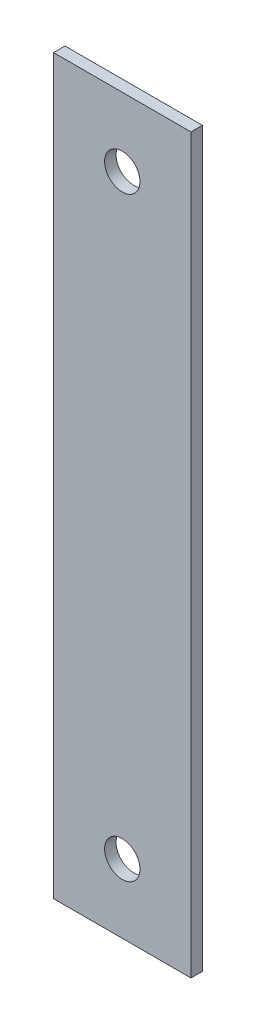
ISO-10303-21;
HEADER;
FILE_DESCRIPTION(('STEP AP214'),'2;1');
FILE_NAME('part.step','',(''),(''),'','','');
FILE_SCHEMA(('AUTOMOTIVE_DESIGN { 1 0 10303 214 1 1 1 1 }'));
ENDSEC;
DATA;
#1=APPLICATION_CONTEXT('core data for automotive mechanical design processes');
#2=APPLICATION_PROTOCOL_DEFINITION('international standard','automotive_design',2000,#1);
#3=PRODUCT_CONTEXT('',#1,'mechanical');
#4=PRODUCT('Part','Part','',(#3));
#5=PRODUCT_RELATED_PRODUCT_CATEGORY('part','',(#4));
#6=PRODUCT_DEFINITION_FORMATION('','',#4);
#7=PRODUCT_DEFINITION_CONTEXT('part definition',#1,'design');
#8=PRODUCT_DEFINITION('design','',#6,#7);
#9=PRODUCT_DEFINITION_SHAPE('','',#8);
#10=(LENGTH_UNIT() NAMED_UNIT(*) SI_UNIT(.MILLI.,.METRE.));
#11=(NAMED_UNIT(*) PLANE_ANGLE_UNIT() SI_UNIT($,.RADIAN.));
#12=(NAMED_UNIT(*) SI_UNIT($,.STERADIAN.) SOLID_ANGLE_UNIT());
#13=UNCERTAINTY_MEASURE_WITH_UNIT(LENGTH_MEASURE(1.E-05),#10,'distance_accuracy_value','');
#14=(GEOMETRIC_REPRESENTATION_CONTEXT(3) GLOBAL_UNCERTAINTY_ASSIGNED_CONTEXT((#13)) GLOBAL_UNIT_ASSIGNED_CONTEXT((#10,
#11,#12)) REPRESENTATION_CONTEXT('',''));
#15=CARTESIAN_POINT('',(0.,0.,0.));
#16=DIRECTION('',(0.,0.,1.));
#17=DIRECTION('',(1.,0.,0.));
#18=AXIS2_PLACEMENT_3D('',#15,#16,#17);
#19=CARTESIAN_POINT('',(0.,0.,3.175));
#20=DIRECTION('',(1.,0.,0.));
#21=DIRECTION('',(0.,0.,-1.));
#22=AXIS2_PLACEMENT_3D('',#19,#20,#21);
#23=PLANE('',#22);
#24=DIRECTION('',(0.,-1.,0.));
#25=VECTOR('',#24,1.);
#26=CARTESIAN_POINT('',(0.,0.,0.));
#27=LINE('',#26,#25);
#28=CARTESIAN_POINT('',(0.,203.2,0.));
#29=VERTEX_POINT('',#28);
#30=CARTESIAN_POINT('',(0.,0.,0.));
#31=VERTEX_POINT('',#30);
#32=EDGE_CURVE('E96',#29,#31,#27,.T.);
#33=ORIENTED_EDGE('',*,*,#32,.T.);
#34=DIRECTION('',(0.,0.,-1.));
#35=VECTOR('',#34,1.);
#36=CARTESIAN_POINT('',(0.,0.,3.175));
#37=LINE('',#36,#35);
#38=CARTESIAN_POINT('',(0.,0.,3.175));
#39=VERTEX_POINT('',#38);
#40=EDGE_CURVE('E11',#39,#31,#37,.T.);
#41=ORIENTED_EDGE('',*,*,#40,.F.);
#42=DIRECTION('',(0.,-1.,0.));
#43=VECTOR('',#42,1.);
#44=CARTESIAN_POINT('',(0.,0.,3.175));
#45=LINE('',#44,#43);
#46=CARTESIAN_POINT('',(0.,203.2,3.175));
#47=VERTEX_POINT('',#46);
#48=EDGE_CURVE('E84',#47,#39,#45,.T.);
#49=ORIENTED_EDGE('',*,*,#48,.F.);
#50=DIRECTION('',(0.,0.,-1.));
#51=VECTOR('',#50,1.);
#52=CARTESIAN_POINT('',(0.,203.2,3.175));
#53=LINE('',#52,#51);
#54=EDGE_CURVE('E92',#47,#29,#53,.T.);
#55=ORIENTED_EDGE('',*,*,#54,.T.);
#56=EDGE_LOOP('',(#33,#41,#49,#55));
#57=FACE_BOUND('',#56,.T.);
#58=ADVANCED_FACE('F33',(#57),#23,.F.);
#59=CARTESIAN_POINT('',(0.,0.,3.175));
#60=DIRECTION('',(0.,1.,0.));
#61=DIRECTION('',(0.,0.,1.));
#62=AXIS2_PLACEMENT_3D('',#59,#60,#61);
#63=PLANE('',#62);
#64=DIRECTION('',(1.,0.,0.));
#65=VECTOR('',#64,1.);
#66=CARTESIAN_POINT('',(0.,0.,0.));
#67=LINE('',#66,#65);
#68=CARTESIAN_POINT('',(38.1,0.,0.));
#69=VERTEX_POINT('',#68);
#70=EDGE_CURVE('E88',#31,#69,#67,.T.);
#71=ORIENTED_EDGE('',*,*,#70,.T.);
#72=DIRECTION('',(0.,0.,-1.));
#73=VECTOR('',#72,1.);
#74=CARTESIAN_POINT('',(38.1,0.,3.175));
#75=LINE('',#74,#73);
#76=CARTESIAN_POINT('',(38.1,0.,3.175));
#77=VERTEX_POINT('',#76);
#78=EDGE_CURVE('E41',#77,#69,#75,.T.);
#79=ORIENTED_EDGE('',*,*,#78,.F.);
#80=DIRECTION('',(1.,0.,0.));
#81=VECTOR('',#80,1.);
#82=CARTESIAN_POINT('',(0.,0.,3.175));
#83=LINE('',#82,#81);
#84=EDGE_CURVE('E79',#39,#77,#83,.T.);
#85=ORIENTED_EDGE('',*,*,#84,.F.);
#86=ORIENTED_EDGE('',*,*,#40,.T.);
#87=EDGE_LOOP('',(#71,#79,#85,#86));
#88=FACE_BOUND('',#87,.T.);
#89=ADVANCED_FACE('F87',(#88),#63,.F.);
#90=CARTESIAN_POINT('',(38.1,0.,3.175));
#91=DIRECTION('',(-1.,0.,0.));
#92=DIRECTION('',(0.,0.,1.));
#93=AXIS2_PLACEMENT_3D('',#90,#91,#92);
#94=PLANE('',#93);
#95=DIRECTION('',(0.,1.,0.));
#96=VECTOR('',#95,1.);
#97=CARTESIAN_POINT('',(38.1,0.,0.));
#98=LINE('',#97,#96);
#99=CARTESIAN_POINT('',(38.1,203.2,0.));
#100=VERTEX_POINT('',#99);
#101=EDGE_CURVE('E66',#69,#100,#98,.T.);
#102=ORIENTED_EDGE('',*,*,#101,.T.);
#103=DIRECTION('',(0.,0.,-1.));
#104=VECTOR('',#103,1.);
#105=CARTESIAN_POINT('',(38.1,203.2,3.175));
#106=LINE('',#105,#104);
#107=CARTESIAN_POINT('',(38.1,203.2,3.175));
#108=VERTEX_POINT('',#107);
#109=EDGE_CURVE('E89',#108,#100,#106,.T.);
#110=ORIENTED_EDGE('',*,*,#109,.F.);
#111=DIRECTION('',(0.,1.,0.));
#112=VECTOR('',#111,1.);
#113=CARTESIAN_POINT('',(38.1,0.,3.175));
#114=LINE('',#113,#112);
#115=EDGE_CURVE('E82',#77,#108,#114,.T.);
#116=ORIENTED_EDGE('',*,*,#115,.F.);
#117=ORIENTED_EDGE('',*,*,#78,.T.);
#118=EDGE_LOOP('',(#102,#110,#116,#117));
#119=FACE_BOUND('',#118,.T.);
#120=ADVANCED_FACE('F90',(#119),#94,.F.);
#121=CARTESIAN_POINT('',(0.,203.2,3.175));
#122=DIRECTION('',(0.,-1.,0.));
#123=DIRECTION('',(0.,0.,-1.));
#124=AXIS2_PLACEMENT_3D('',#121,#122,#123);
#125=PLANE('',#124);
#126=DIRECTION('',(-1.,0.,0.));
#127=VECTOR('',#126,1.);
#128=CARTESIAN_POINT('',(0.,203.2,0.));
#129=LINE('',#128,#127);
#130=EDGE_CURVE('E72',#100,#29,#129,.T.);
#131=ORIENTED_EDGE('',*,*,#130,.T.);
#132=ORIENTED_EDGE('',*,*,#54,.F.);
#133=DIRECTION('',(-1.,0.,0.));
#134=VECTOR('',#133,1.);
#135=CARTESIAN_POINT('',(0.,203.2,3.175));
#136=LINE('',#135,#134);
#137=EDGE_CURVE('E49',#108,#47,#136,.T.);
#138=ORIENTED_EDGE('',*,*,#137,.F.);
#139=ORIENTED_EDGE('',*,*,#109,.T.);
#140=EDGE_LOOP('',(#131,#132,#138,#139));
#141=FACE_BOUND('',#140,.T.);
#142=ADVANCED_FACE('F104',(#141),#125,.F.);
#143=CARTESIAN_POINT('',(0.,0.,3.175));
#144=DIRECTION('',(0.,0.,-1.));
#145=DIRECTION('',(-1.,0.,0.));
#146=AXIS2_PLACEMENT_3D('',#143,#144,#145);
#147=PLANE('',#146);
#148=CARTESIAN_POINT('',(19.05,184.15,3.175));
#149=DIRECTION('',(0.,0.,1.));
#150=DIRECTION('',(1.,0.,0.));
#151=AXIS2_PLACEMENT_3D('',#148,#149,#150);
#152=CIRCLE('',#151,4.9022);
#153=CARTESIAN_POINT('',(23.9522,184.15,3.175));
#154=VERTEX_POINT('',#153);
#155=EDGE_CURVE('E118',#154,#154,#152,.T.);
#156=ORIENTED_EDGE('',*,*,#155,.F.);
#157=EDGE_LOOP('',(#156));
#158=FACE_BOUND('',#157,.T.);
#159=CARTESIAN_POINT('',(19.05,19.05,3.175));
#160=DIRECTION('',(0.,0.,1.));
#161=DIRECTION('',(1.,0.,0.));
#162=AXIS2_PLACEMENT_3D('',#159,#160,#161);
#163=CIRCLE('',#162,4.9022);
#164=CARTESIAN_POINT('',(23.9522,19.05,3.175));
#165=VERTEX_POINT('',#164);
#166=EDGE_CURVE('E112',#165,#165,#163,.T.);
#167=ORIENTED_EDGE('',*,*,#166,.F.);
#168=EDGE_LOOP('',(#167));
#169=FACE_BOUND('',#168,.T.);
#170=ORIENTED_EDGE('',*,*,#48,.T.);
#171=ORIENTED_EDGE('',*,*,#84,.T.);
#172=ORIENTED_EDGE('',*,*,#115,.T.);
#173=ORIENTED_EDGE('',*,*,#137,.T.);
#174=EDGE_LOOP('',(#170,#171,#172,#173));
#175=FACE_BOUND('',#174,.T.);
#176=ADVANCED_FACE('F80',(#158,#169,#175),#147,.F.);
#177=CARTESIAN_POINT('',(0.,0.,0.));
#178=DIRECTION('',(0.,0.,-1.));
#179=DIRECTION('',(-1.,0.,0.));
#180=AXIS2_PLACEMENT_3D('',#177,#178,#179);
#181=PLANE('',#180);
#182=CARTESIAN_POINT('',(19.05,184.15,0.));
#183=DIRECTION('',(0.,0.,1.));
#184=DIRECTION('',(1.,0.,0.));
#185=AXIS2_PLACEMENT_3D('',#182,#183,#184);
#186=CIRCLE('',#185,4.9022);
#187=CARTESIAN_POINT('',(23.9522,184.15,0.));
#188=VERTEX_POINT('',#187);
#189=EDGE_CURVE('E115',#188,#188,#186,.T.);
#190=ORIENTED_EDGE('',*,*,#189,.T.);
#191=EDGE_LOOP('',(#190));
#192=FACE_BOUND('',#191,.T.);
#193=CARTESIAN_POINT('',(19.05,19.05,0.));
#194=DIRECTION('',(0.,0.,1.));
#195=DIRECTION('',(1.,0.,0.));
#196=AXIS2_PLACEMENT_3D('',#193,#194,#195);
#197=CIRCLE('',#196,4.9022);
#198=CARTESIAN_POINT('',(23.9522,19.05,0.));
#199=VERTEX_POINT('',#198);
#200=EDGE_CURVE('E99',#199,#199,#197,.T.);
#201=ORIENTED_EDGE('',*,*,#200,.T.);
#202=EDGE_LOOP('',(#201));
#203=FACE_BOUND('',#202,.T.);
#204=ORIENTED_EDGE('',*,*,#32,.F.);
#205=ORIENTED_EDGE('',*,*,#130,.F.);
#206=ORIENTED_EDGE('',*,*,#101,.F.);
#207=ORIENTED_EDGE('',*,*,#70,.F.);
#208=EDGE_LOOP('',(#204,#205,#206,#207));
#209=FACE_BOUND('',#208,.T.);
#210=ADVANCED_FACE('F107',(#192,#203,#209),#181,.T.);
#211=CARTESIAN_POINT('',(19.05,19.05,3.175));
#212=DIRECTION('',(0.,0.,1.));
#213=DIRECTION('',(1.,0.,0.));
#214=AXIS2_PLACEMENT_3D('',#211,#212,#213);
#215=CYLINDRICAL_SURFACE('',#214,4.9022);
#216=ORIENTED_EDGE('',*,*,#200,.F.);
#217=EDGE_LOOP('',(#216));
#218=FACE_BOUND('',#217,.T.);
#219=ORIENTED_EDGE('',*,*,#166,.T.);
#220=EDGE_LOOP('',(#219));
#221=FACE_BOUND('',#220,.T.);
#222=ADVANCED_FACE('F129',(#218,#221),#215,.F.);
#223=CARTESIAN_POINT('',(19.05,184.15,3.175));
#224=DIRECTION('',(0.,0.,1.));
#225=DIRECTION('',(1.,0.,0.));
#226=AXIS2_PLACEMENT_3D('',#223,#224,#225);
#227=CYLINDRICAL_SURFACE('',#226,4.9022);
#228=ORIENTED_EDGE('',*,*,#189,.F.);
#229=EDGE_LOOP('',(#228));
#230=FACE_BOUND('',#229,.T.);
#231=ORIENTED_EDGE('',*,*,#155,.T.);
#232=EDGE_LOOP('',(#231));
#233=FACE_BOUND('',#232,.T.);
#234=ADVANCED_FACE('F122',(#230,#233),#227,.F.);
#235=CLOSED_SHELL('',(#58,#89,#120,#142,#176,#210,#222,#234));
#236=MANIFOLD_SOLID_BREP('B2',#235);
#237=ADVANCED_BREP_SHAPE_REPRESENTATION('',(#18,#236),#14);
#238=SHAPE_DEFINITION_REPRESENTATION(#9,#237);
ENDSEC;
END-ISO-10303-21;
